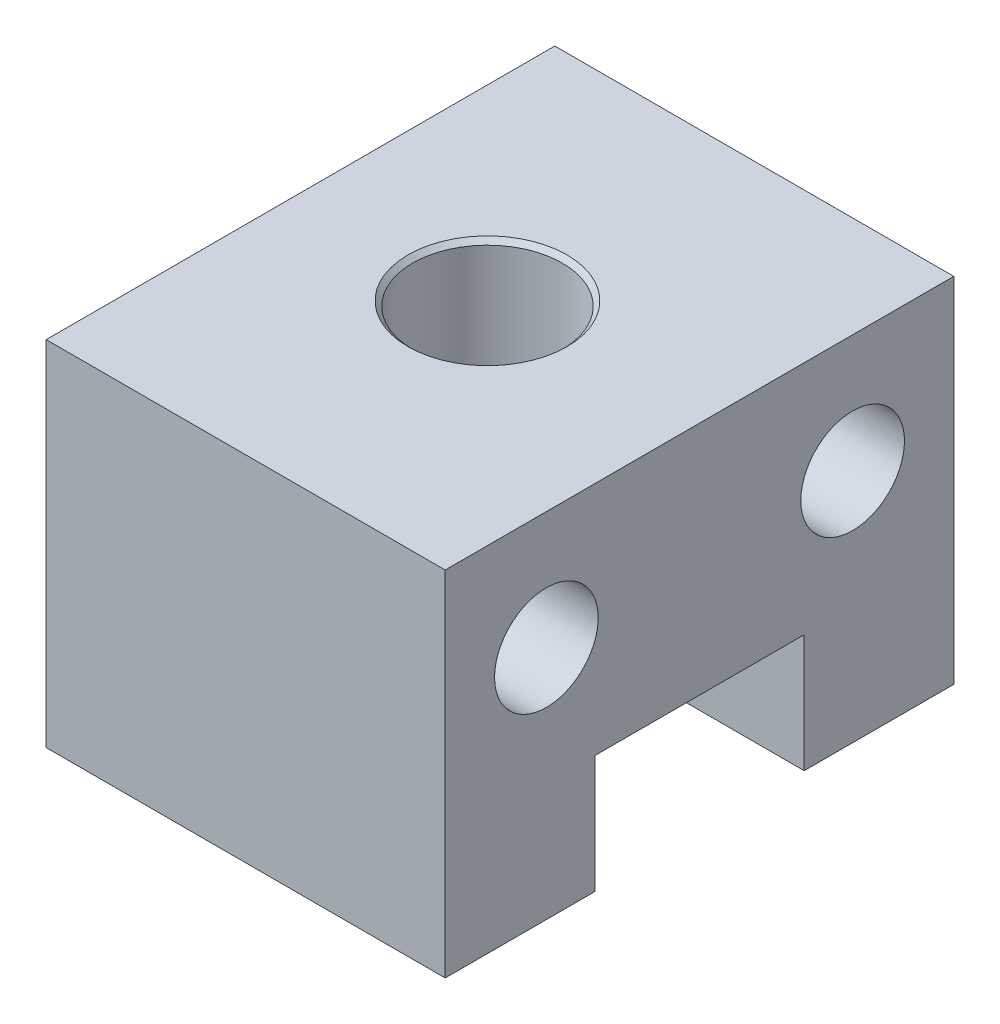
ISO-10303-21;
HEADER;
FILE_DESCRIPTION(('STEP AP214'),'2;1');
FILE_NAME('part.step','',(''),(''),'','','');
FILE_SCHEMA(('AUTOMOTIVE_DESIGN { 1 0 10303 214 1 1 1 1 }'));
ENDSEC;
DATA;
#1=APPLICATION_CONTEXT('core data for automotive mechanical design processes');
#2=APPLICATION_PROTOCOL_DEFINITION('international standard','automotive_design',2000,#1);
#3=PRODUCT_CONTEXT('',#1,'mechanical');
#4=PRODUCT('Part','Part','',(#3));
#5=PRODUCT_RELATED_PRODUCT_CATEGORY('part','',(#4));
#6=PRODUCT_DEFINITION_FORMATION('','',#4);
#7=PRODUCT_DEFINITION_CONTEXT('part definition',#1,'design');
#8=PRODUCT_DEFINITION('design','',#6,#7);
#9=PRODUCT_DEFINITION_SHAPE('','',#8);
#10=(LENGTH_UNIT() NAMED_UNIT(*) SI_UNIT(.MILLI.,.METRE.));
#11=(NAMED_UNIT(*) PLANE_ANGLE_UNIT() SI_UNIT($,.RADIAN.));
#12=(NAMED_UNIT(*) SI_UNIT($,.STERADIAN.) SOLID_ANGLE_UNIT());
#13=UNCERTAINTY_MEASURE_WITH_UNIT(LENGTH_MEASURE(1.E-05),#10,'distance_accuracy_value','');
#14=(GEOMETRIC_REPRESENTATION_CONTEXT(3) GLOBAL_UNCERTAINTY_ASSIGNED_CONTEXT((#13)) GLOBAL_UNIT_ASSIGNED_CONTEXT((#10,
#11,#12)) REPRESENTATION_CONTEXT('',''));
#15=CARTESIAN_POINT('',(0.,0.,0.));
#16=DIRECTION('',(0.,0.,1.));
#17=DIRECTION('',(1.,0.,0.));
#18=AXIS2_PLACEMENT_3D('',#15,#16,#17);
#19=CARTESIAN_POINT('',(44.45,0.,53.975));
#20=DIRECTION('',(0.,1.,0.));
#21=DIRECTION('',(0.,0.,1.));
#22=AXIS2_PLACEMENT_3D('',#19,#20,#21);
#23=PLANE('',#22);
#24=CARTESIAN_POINT('',(13.3985,0.,-34.925));
#25=DIRECTION('',(0.,-1.,0.));
#26=DIRECTION('',(0.,0.,-1.));
#27=AXIS2_PLACEMENT_3D('',#24,#25,#26);
#28=CIRCLE('',#27,2.5);
#29=CARTESIAN_POINT('',(13.3985,0.,-37.425));
#30=VERTEX_POINT('',#29);
#31=EDGE_CURVE('E178',#30,#30,#28,.T.);
#32=ORIENTED_EDGE('',*,*,#31,.F.);
#33=EDGE_LOOP('',(#32));
#34=FACE_BOUND('',#33,.T.);
#35=CARTESIAN_POINT('',(-22.9235,0.,-34.925));
#36=DIRECTION('',(0.,-1.,0.));
#37=DIRECTION('',(0.,0.,-1.));
#38=AXIS2_PLACEMENT_3D('',#35,#36,#37);
#39=CIRCLE('',#38,2.5);
#40=CARTESIAN_POINT('',(-22.9235,0.,-37.425));
#41=VERTEX_POINT('',#40);
#42=EDGE_CURVE('E167',#41,#41,#39,.T.);
#43=ORIENTED_EDGE('',*,*,#42,.F.);
#44=EDGE_LOOP('',(#43));
#45=FACE_BOUND('',#44,.T.);
#46=DIRECTION('',(-1.,0.,0.));
#47=VECTOR('',#46,1.);
#48=CARTESIAN_POINT('',(-44.45,0.,-53.975));
#49=LINE('',#48,#47);
#50=CARTESIAN_POINT('',(40.2375,0.,-53.975));
#51=VERTEX_POINT('',#50);
#52=CARTESIAN_POINT('',(-44.45,0.,-53.975));
#53=VERTEX_POINT('',#52);
#54=EDGE_CURVE('E89',#51,#53,#49,.T.);
#55=ORIENTED_EDGE('',*,*,#54,.F.);
#56=DIRECTION('',(0.,0.,1.));
#57=VECTOR('',#56,1.);
#58=CARTESIAN_POINT('',(40.2375,0.,-53.975));
#59=LINE('',#58,#57);
#60=CARTESIAN_POINT('',(40.2375,0.,-22.225));
#61=VERTEX_POINT('',#60);
#62=EDGE_CURVE('E203',#51,#61,#59,.T.);
#63=ORIENTED_EDGE('',*,*,#62,.T.);
#64=DIRECTION('',(1.,0.,0.));
#65=VECTOR('',#64,1.);
#66=CARTESIAN_POINT('',(44.45,0.,-22.225));
#67=LINE('',#66,#65);
#68=CARTESIAN_POINT('',(-44.45,0.,-22.225));
#69=VERTEX_POINT('',#68);
#70=EDGE_CURVE('E200',#69,#61,#67,.T.);
#71=ORIENTED_EDGE('',*,*,#70,.F.);
#72=DIRECTION('',(0.,0.,1.));
#73=VECTOR('',#72,1.);
#74=CARTESIAN_POINT('',(-44.45,0.,-53.975));
#75=LINE('',#74,#73);
#76=EDGE_CURVE('E88',#53,#69,#75,.T.);
#77=ORIENTED_EDGE('',*,*,#76,.F.);
#78=EDGE_LOOP('',(#55,#63,#71,#77));
#79=FACE_BOUND('',#78,.T.);
#80=ADVANCED_FACE('F38',(#34,#45,#79),#23,.F.);
#81=CARTESIAN_POINT('',(-4.7625,-128.2,0.));
#82=DIRECTION('',(0.,1.,0.));
#83=DIRECTION('',(0.,0.,1.));
#84=AXIS2_PLACEMENT_3D('',#81,#82,#83);
#85=CYLINDRICAL_SURFACE('',#84,14.2875);
#86=CARTESIAN_POINT('',(-4.7625,25.,0.));
#87=DIRECTION('',(0.,1.,0.));
#88=DIRECTION('',(0.,0.,1.));
#89=AXIS2_PLACEMENT_3D('',#86,#87,#88);
#90=CIRCLE('',#89,14.2875);
#91=CARTESIAN_POINT('',(-4.7625,25.,14.2875));
#92=VERTEX_POINT('',#91);
#93=EDGE_CURVE('E222',#92,#92,#90,.F.);
#94=ORIENTED_EDGE('',*,*,#93,.T.);
#95=EDGE_LOOP('',(#94));
#96=FACE_BOUND('',#95,.T.);
#97=CARTESIAN_POINT('',(-4.7625,36.646,0.));
#98=DIRECTION('',(0.,1.,0.));
#99=DIRECTION('',(0.,0.,1.));
#100=AXIS2_PLACEMENT_3D('',#97,#98,#99);
#101=CIRCLE('',#100,14.2875);
#102=CARTESIAN_POINT('',(-4.7625,36.646,14.2875));
#103=VERTEX_POINT('',#102);
#104=EDGE_CURVE('E109',#103,#103,#101,.F.);
#105=ORIENTED_EDGE('',*,*,#104,.F.);
#106=EDGE_LOOP('',(#105));
#107=FACE_BOUND('',#106,.T.);
#108=ADVANCED_FACE('F131',(#96,#107),#85,.F.);
#109=CARTESIAN_POINT('',(-44.45,75.,-53.975));
#110=DIRECTION('',(0.,0.,1.));
#111=DIRECTION('',(1.,0.,0.));
#112=AXIS2_PLACEMENT_3D('',#109,#110,#111);
#113=PLANE('',#112);
#114=DIRECTION('',(-1.,0.,0.));
#115=VECTOR('',#114,1.);
#116=CARTESIAN_POINT('',(-44.45,75.,-53.975));
#117=LINE('',#116,#115);
#118=CARTESIAN_POINT('',(40.2375,75.,-53.975));
#119=VERTEX_POINT('',#118);
#120=CARTESIAN_POINT('',(-44.45,75.,-53.975));
#121=VERTEX_POINT('',#120);
#122=EDGE_CURVE('E101',#119,#121,#117,.T.);
#123=ORIENTED_EDGE('',*,*,#122,.F.);
#124=DIRECTION('',(0.,1.,0.));
#125=VECTOR('',#124,1.);
#126=CARTESIAN_POINT('',(40.2375,0.,-53.975));
#127=LINE('',#126,#125);
#128=EDGE_CURVE('E192',#51,#119,#127,.T.);
#129=ORIENTED_EDGE('',*,*,#128,.F.);
#130=ORIENTED_EDGE('',*,*,#54,.T.);
#131=DIRECTION('',(0.,-1.,0.));
#132=VECTOR('',#131,1.);
#133=CARTESIAN_POINT('',(-44.45,75.,-53.975));
#134=LINE('',#133,#132);
#135=EDGE_CURVE('E98',#121,#53,#134,.T.);
#136=ORIENTED_EDGE('',*,*,#135,.F.);
#137=EDGE_LOOP('',(#123,#129,#130,#136));
#138=FACE_BOUND('',#137,.T.);
#139=ADVANCED_FACE('F137',(#138),#113,.F.);
#140=CARTESIAN_POINT('',(-44.45,75.,-53.975));
#141=DIRECTION('',(1.,0.,0.));
#142=DIRECTION('',(0.,0.,-1.));
#143=AXIS2_PLACEMENT_3D('',#140,#141,#142);
#144=PLANE('',#143);
#145=CARTESIAN_POINT('',(-44.45,50.,32.5));
#146=DIRECTION('',(-1.,0.,0.));
#147=DIRECTION('',(0.,0.,1.));
#148=AXIS2_PLACEMENT_3D('',#145,#146,#147);
#149=CIRCLE('',#148,16.5);
#150=CARTESIAN_POINT('',(-44.45,50.,49.));
#151=VERTEX_POINT('',#150);
#152=EDGE_CURVE('E469',#151,#151,#149,.T.);
#153=ORIENTED_EDGE('',*,*,#152,.F.);
#154=EDGE_LOOP('',(#153));
#155=FACE_BOUND('',#154,.T.);
#156=CARTESIAN_POINT('',(-44.45,50.,-32.5));
#157=DIRECTION('',(-1.,0.,0.));
#158=DIRECTION('',(0.,0.,1.));
#159=AXIS2_PLACEMENT_3D('',#156,#157,#158);
#160=CIRCLE('',#159,16.5);
#161=CARTESIAN_POINT('',(-44.45,50.,-16.));
#162=VERTEX_POINT('',#161);
#163=EDGE_CURVE('E478',#162,#162,#160,.T.);
#164=ORIENTED_EDGE('',*,*,#163,.F.);
#165=EDGE_LOOP('',(#164));
#166=FACE_BOUND('',#165,.T.);
#167=ORIENTED_EDGE('',*,*,#76,.T.);
#168=DIRECTION('',(0.,-1.,0.));
#169=VECTOR('',#168,1.);
#170=CARTESIAN_POINT('',(-44.45,25.,-22.225));
#171=LINE('',#170,#169);
#172=CARTESIAN_POINT('',(-44.45,25.,-22.225));
#173=VERTEX_POINT('',#172);
#174=EDGE_CURVE('E220',#173,#69,#171,.T.);
#175=ORIENTED_EDGE('',*,*,#174,.F.);
#176=DIRECTION('',(0.,0.,-1.));
#177=VECTOR('',#176,1.);
#178=CARTESIAN_POINT('',(-44.45,25.,22.225));
#179=LINE('',#178,#177);
#180=CARTESIAN_POINT('',(-44.45,25.,22.225));
#181=VERTEX_POINT('',#180);
#182=EDGE_CURVE('E213',#181,#173,#179,.T.);
#183=ORIENTED_EDGE('',*,*,#182,.F.);
#184=DIRECTION('',(0.,-1.,0.));
#185=VECTOR('',#184,1.);
#186=CARTESIAN_POINT('',(-44.45,25.,22.225));
#187=LINE('',#186,#185);
#188=CARTESIAN_POINT('',(-44.45,0.,22.225));
#189=VERTEX_POINT('',#188);
#190=EDGE_CURVE('E84',#181,#189,#187,.T.);
#191=ORIENTED_EDGE('',*,*,#190,.T.);
#192=CARTESIAN_POINT('',(-44.45,0.,53.975));
#193=VERTEX_POINT('',#192);
#194=EDGE_CURVE('E75',#189,#193,#75,.T.);
#195=ORIENTED_EDGE('',*,*,#194,.T.);
#196=DIRECTION('',(0.,-1.,0.));
#197=VECTOR('',#196,1.);
#198=CARTESIAN_POINT('',(-44.45,75.,53.975));
#199=LINE('',#198,#197);
#200=CARTESIAN_POINT('',(-44.45,75.,53.975));
#201=VERTEX_POINT('',#200);
#202=EDGE_CURVE('E79',#201,#193,#199,.T.);
#203=ORIENTED_EDGE('',*,*,#202,.F.);
#204=DIRECTION('',(0.,0.,1.));
#205=VECTOR('',#204,1.);
#206=CARTESIAN_POINT('',(-44.45,75.,-53.975));
#207=LINE('',#206,#205);
#208=EDGE_CURVE('E62',#121,#201,#207,.T.);
#209=ORIENTED_EDGE('',*,*,#208,.F.);
#210=ORIENTED_EDGE('',*,*,#135,.T.);
#211=EDGE_LOOP('',(#167,#175,#183,#191,#195,#203,#209,#210));
#212=FACE_BOUND('',#211,.T.);
#213=ADVANCED_FACE('F78',(#155,#166,#212),#144,.F.);
#214=CARTESIAN_POINT('',(-44.45,75.,53.975));
#215=DIRECTION('',(0.,0.,-1.));
#216=DIRECTION('',(-1.,0.,0.));
#217=AXIS2_PLACEMENT_3D('',#214,#215,#216);
#218=PLANE('',#217);
#219=DIRECTION('',(1.,0.,0.));
#220=VECTOR('',#219,1.);
#221=CARTESIAN_POINT('',(-44.45,0.,53.975));
#222=LINE('',#221,#220);
#223=CARTESIAN_POINT('',(40.2375,0.,53.975));
#224=VERTEX_POINT('',#223);
#225=EDGE_CURVE('E96',#193,#224,#222,.T.);
#226=ORIENTED_EDGE('',*,*,#225,.T.);
#227=DIRECTION('',(0.,1.,0.));
#228=VECTOR('',#227,1.);
#229=CARTESIAN_POINT('',(40.2375,0.,53.975));
#230=LINE('',#229,#228);
#231=CARTESIAN_POINT('',(40.2375,75.,53.975));
#232=VERTEX_POINT('',#231);
#233=EDGE_CURVE('E494',#224,#232,#230,.T.);
#234=ORIENTED_EDGE('',*,*,#233,.T.);
#235=DIRECTION('',(1.,0.,0.));
#236=VECTOR('',#235,1.);
#237=CARTESIAN_POINT('',(-44.45,75.,53.975));
#238=LINE('',#237,#236);
#239=EDGE_CURVE('E97',#201,#232,#238,.T.);
#240=ORIENTED_EDGE('',*,*,#239,.F.);
#241=ORIENTED_EDGE('',*,*,#202,.T.);
#242=EDGE_LOOP('',(#226,#234,#240,#241));
#243=FACE_BOUND('',#242,.T.);
#244=ADVANCED_FACE('F93',(#243),#218,.F.);
#245=CARTESIAN_POINT('',(44.45,75.,53.975));
#246=DIRECTION('',(0.,1.,0.));
#247=DIRECTION('',(0.,0.,1.));
#248=AXIS2_PLACEMENT_3D('',#245,#246,#247);
#249=PLANE('',#248);
#250=CARTESIAN_POINT('',(-4.7625,75.,0.));
#251=DIRECTION('',(0.,1.,0.));
#252=DIRECTION('',(0.,0.,1.));
#253=AXIS2_PLACEMENT_3D('',#250,#251,#252);
#254=CIRCLE('',#253,16.8750000000001);
#255=CARTESIAN_POINT('',(-4.7625,75.,16.8750000000001));
#256=VERTEX_POINT('',#255);
#257=EDGE_CURVE('E11',#256,#256,#254,.F.);
#258=ORIENTED_EDGE('',*,*,#257,.T.);
#259=EDGE_LOOP('',(#258));
#260=FACE_BOUND('',#259,.T.);
#261=DIRECTION('',(0.,0.,1.));
#262=VECTOR('',#261,1.);
#263=CARTESIAN_POINT('',(40.2375,75.,-53.975));
#264=LINE('',#263,#262);
#265=EDGE_CURVE('E490',#119,#232,#264,.T.);
#266=ORIENTED_EDGE('',*,*,#265,.F.);
#267=ORIENTED_EDGE('',*,*,#122,.T.);
#268=ORIENTED_EDGE('',*,*,#208,.T.);
#269=ORIENTED_EDGE('',*,*,#239,.T.);
#270=EDGE_LOOP('',(#266,#267,#268,#269));
#271=FACE_BOUND('',#270,.T.);
#272=ADVANCED_FACE('F146',(#260,#271),#249,.T.);
#273=CARTESIAN_POINT('',(-22.9235,0.,34.925));
#274=DIRECTION('',(0.,-1.,0.));
#275=DIRECTION('',(0.,0.,-1.));
#276=AXIS2_PLACEMENT_3D('',#273,#274,#275);
#277=CIRCLE('',#276,2.5);
#278=CARTESIAN_POINT('',(-22.9235,0.,32.425));
#279=VERTEX_POINT('',#278);
#280=EDGE_CURVE('E112',#279,#279,#277,.T.);
#281=ORIENTED_EDGE('',*,*,#280,.F.);
#282=EDGE_LOOP('',(#281));
#283=FACE_BOUND('',#282,.T.);
#284=CARTESIAN_POINT('',(13.3985,0.,34.925));
#285=DIRECTION('',(0.,-1.,0.));
#286=DIRECTION('',(0.,0.,-1.));
#287=AXIS2_PLACEMENT_3D('',#284,#285,#286);
#288=CIRCLE('',#287,2.5);
#289=CARTESIAN_POINT('',(13.3985,0.,32.425));
#290=VERTEX_POINT('',#289);
#291=EDGE_CURVE('E161',#290,#290,#288,.T.);
#292=ORIENTED_EDGE('',*,*,#291,.F.);
#293=EDGE_LOOP('',(#292));
#294=FACE_BOUND('',#293,.T.);
#295=DIRECTION('',(-1.,0.,0.));
#296=VECTOR('',#295,1.);
#297=CARTESIAN_POINT('',(44.45,0.,22.225));
#298=LINE('',#297,#296);
#299=CARTESIAN_POINT('',(40.2375,0.,22.225));
#300=VERTEX_POINT('',#299);
#301=EDGE_CURVE('E210',#300,#189,#298,.T.);
#302=ORIENTED_EDGE('',*,*,#301,.F.);
#303=EDGE_CURVE('E53',#300,#224,#59,.T.);
#304=ORIENTED_EDGE('',*,*,#303,.T.);
#305=ORIENTED_EDGE('',*,*,#225,.F.);
#306=ORIENTED_EDGE('',*,*,#194,.F.);
#307=EDGE_LOOP('',(#302,#304,#305,#306));
#308=FACE_BOUND('',#307,.T.);
#309=ADVANCED_FACE('F100',(#283,#294,#308),#23,.F.);
#310=CARTESIAN_POINT('',(13.3985,27.9908,-34.925));
#311=DIRECTION('',(0.,-1.,0.));
#312=DIRECTION('',(0.,0.,-1.));
#313=AXIS2_PLACEMENT_3D('',#310,#311,#312);
#314=CONICAL_SURFACE('',#313,2.49999999999999,1.02974425867665);
#315=CARTESIAN_POINT('',(13.3985,29.4929515475689,-34.925));
#316=VERTEX_POINT('',#315);
#317=VERTEX_LOOP('',#316);
#318=FACE_BOUND('',#317,.T.);
#319=CARTESIAN_POINT('',(13.3985,27.9908,-34.925));
#320=DIRECTION('',(0.,-1.,0.));
#321=DIRECTION('',(0.,0.,-1.));
#322=AXIS2_PLACEMENT_3D('',#319,#320,#321);
#323=CIRCLE('',#322,2.49999999999999);
#324=CARTESIAN_POINT('',(13.3985,27.9908,-37.425));
#325=VERTEX_POINT('',#324);
#326=EDGE_CURVE('E181',#325,#325,#323,.T.);
#327=ORIENTED_EDGE('',*,*,#326,.T.);
#328=EDGE_LOOP('',(#327));
#329=FACE_BOUND('',#328,.T.);
#330=ADVANCED_FACE('F145',(#318,#329),#314,.F.);
#331=CARTESIAN_POINT('',(13.3985,0.,-34.925));
#332=DIRECTION('',(0.,-1.,0.));
#333=DIRECTION('',(0.,0.,-1.));
#334=AXIS2_PLACEMENT_3D('',#331,#332,#333);
#335=CYLINDRICAL_SURFACE('',#334,2.5);
#336=ORIENTED_EDGE('',*,*,#326,.F.);
#337=EDGE_LOOP('',(#336));
#338=FACE_BOUND('',#337,.T.);
#339=ORIENTED_EDGE('',*,*,#31,.T.);
#340=EDGE_LOOP('',(#339));
#341=FACE_BOUND('',#340,.T.);
#342=ADVANCED_FACE('F152',(#338,#341),#335,.F.);
#343=CARTESIAN_POINT('',(-22.9235,27.9908,-34.925));
#344=DIRECTION('',(0.,-1.,0.));
#345=DIRECTION('',(0.,0.,-1.));
#346=AXIS2_PLACEMENT_3D('',#343,#344,#345);
#347=CONICAL_SURFACE('',#346,2.5,1.02974425867665);
#348=CARTESIAN_POINT('',(-22.9235,29.4929515475689,-34.925));
#349=VERTEX_POINT('',#348);
#350=VERTEX_LOOP('',#349);
#351=FACE_BOUND('',#350,.T.);
#352=CARTESIAN_POINT('',(-22.9235,27.9908,-34.925));
#353=DIRECTION('',(0.,-1.,0.));
#354=DIRECTION('',(0.,0.,-1.));
#355=AXIS2_PLACEMENT_3D('',#352,#353,#354);
#356=CIRCLE('',#355,2.5);
#357=CARTESIAN_POINT('',(-22.9235,27.9908,-37.425));
#358=VERTEX_POINT('',#357);
#359=EDGE_CURVE('E175',#358,#358,#356,.T.);
#360=ORIENTED_EDGE('',*,*,#359,.T.);
#361=EDGE_LOOP('',(#360));
#362=FACE_BOUND('',#361,.T.);
#363=ADVANCED_FACE('F257',(#351,#362),#347,.F.);
#364=CARTESIAN_POINT('',(-22.9235,0.,-34.925));
#365=DIRECTION('',(0.,-1.,0.));
#366=DIRECTION('',(0.,0.,-1.));
#367=AXIS2_PLACEMENT_3D('',#364,#365,#366);
#368=CYLINDRICAL_SURFACE('',#367,2.5);
#369=ORIENTED_EDGE('',*,*,#359,.F.);
#370=EDGE_LOOP('',(#369));
#371=FACE_BOUND('',#370,.T.);
#372=ORIENTED_EDGE('',*,*,#42,.T.);
#373=EDGE_LOOP('',(#372));
#374=FACE_BOUND('',#373,.T.);
#375=ADVANCED_FACE('F253',(#371,#374),#368,.F.);
#376=CARTESIAN_POINT('',(13.3985,27.9908,34.925));
#377=DIRECTION('',(0.,-1.,0.));
#378=DIRECTION('',(0.,0.,-1.));
#379=AXIS2_PLACEMENT_3D('',#376,#377,#378);
#380=CONICAL_SURFACE('',#379,2.49999999999999,1.02974425867665);
#381=CARTESIAN_POINT('',(13.3985,29.4929515475689,34.925));
#382=VERTEX_POINT('',#381);
#383=VERTEX_LOOP('',#382);
#384=FACE_BOUND('',#383,.T.);
#385=CARTESIAN_POINT('',(13.3985,27.9908,34.925));
#386=DIRECTION('',(0.,-1.,0.));
#387=DIRECTION('',(0.,0.,-1.));
#388=AXIS2_PLACEMENT_3D('',#385,#386,#387);
#389=CIRCLE('',#388,2.49999999999999);
#390=CARTESIAN_POINT('',(13.3985,27.9908,32.425));
#391=VERTEX_POINT('',#390);
#392=EDGE_CURVE('E163',#391,#391,#389,.T.);
#393=ORIENTED_EDGE('',*,*,#392,.T.);
#394=EDGE_LOOP('',(#393));
#395=FACE_BOUND('',#394,.T.);
#396=ADVANCED_FACE('F249',(#384,#395),#380,.F.);
#397=CARTESIAN_POINT('',(13.3985,0.,34.925));
#398=DIRECTION('',(0.,-1.,0.));
#399=DIRECTION('',(0.,0.,-1.));
#400=AXIS2_PLACEMENT_3D('',#397,#398,#399);
#401=CYLINDRICAL_SURFACE('',#400,2.5);
#402=ORIENTED_EDGE('',*,*,#392,.F.);
#403=EDGE_LOOP('',(#402));
#404=FACE_BOUND('',#403,.T.);
#405=ORIENTED_EDGE('',*,*,#291,.T.);
#406=EDGE_LOOP('',(#405));
#407=FACE_BOUND('',#406,.T.);
#408=ADVANCED_FACE('F241',(#404,#407),#401,.F.);
#409=CARTESIAN_POINT('',(-22.9235,27.9908,34.925));
#410=DIRECTION('',(0.,-1.,0.));
#411=DIRECTION('',(0.,0.,-1.));
#412=AXIS2_PLACEMENT_3D('',#409,#410,#411);
#413=CONICAL_SURFACE('',#412,2.5,1.02974425867665);
#414=CARTESIAN_POINT('',(-22.9235,29.4929515475689,34.925));
#415=VERTEX_POINT('',#414);
#416=VERTEX_LOOP('',#415);
#417=FACE_BOUND('',#416,.T.);
#418=CARTESIAN_POINT('',(-22.9235,27.9908,34.925));
#419=DIRECTION('',(0.,-1.,0.));
#420=DIRECTION('',(0.,0.,-1.));
#421=AXIS2_PLACEMENT_3D('',#418,#419,#420);
#422=CIRCLE('',#421,2.5);
#423=CARTESIAN_POINT('',(-22.9235,27.9908,32.425));
#424=VERTEX_POINT('',#423);
#425=EDGE_CURVE('E164',#424,#424,#422,.T.);
#426=ORIENTED_EDGE('',*,*,#425,.T.);
#427=EDGE_LOOP('',(#426));
#428=FACE_BOUND('',#427,.T.);
#429=ADVANCED_FACE('F232',(#417,#428),#413,.F.);
#430=CARTESIAN_POINT('',(-22.9235,0.,34.925));
#431=DIRECTION('',(0.,-1.,0.));
#432=DIRECTION('',(0.,0.,-1.));
#433=AXIS2_PLACEMENT_3D('',#430,#431,#432);
#434=CYLINDRICAL_SURFACE('',#433,2.5);
#435=ORIENTED_EDGE('',*,*,#425,.F.);
#436=EDGE_LOOP('',(#435));
#437=FACE_BOUND('',#436,.T.);
#438=ORIENTED_EDGE('',*,*,#280,.T.);
#439=EDGE_LOOP('',(#438));
#440=FACE_BOUND('',#439,.T.);
#441=ADVANCED_FACE('F229',(#437,#440),#434,.F.);
#442=CARTESIAN_POINT('',(-4.7625,36.646,0.));
#443=DIRECTION('',(0.,1.,0.));
#444=DIRECTION('',(0.,0.,1.));
#445=AXIS2_PLACEMENT_3D('',#442,#443,#444);
#446=PLANE('',#445);
#447=CARTESIAN_POINT('',(-4.7625,36.646,0.));
#448=DIRECTION('',(0.,1.,0.));
#449=DIRECTION('',(0.,0.,1.));
#450=AXIS2_PLACEMENT_3D('',#447,#448,#449);
#451=CIRCLE('',#450,15.875);
#452=CARTESIAN_POINT('',(-4.7625,36.646,15.875));
#453=VERTEX_POINT('',#452);
#454=EDGE_CURVE('E113',#453,#453,#451,.T.);
#455=ORIENTED_EDGE('',*,*,#454,.T.);
#456=EDGE_LOOP('',(#455));
#457=FACE_BOUND('',#456,.T.);
#458=ORIENTED_EDGE('',*,*,#104,.T.);
#459=EDGE_LOOP('',(#458));
#460=FACE_BOUND('',#459,.T.);
#461=ADVANCED_FACE('F231',(#457,#460),#446,.T.);
#462=CARTESIAN_POINT('',(-4.7625,36.646,0.));
#463=DIRECTION('',(0.,1.,0.));
#464=DIRECTION('',(0.,0.,1.));
#465=AXIS2_PLACEMENT_3D('',#462,#463,#464);
#466=CYLINDRICAL_SURFACE('',#465,15.875);
#467=CARTESIAN_POINT('',(-4.7625,73.9999999999998,0.));
#468=DIRECTION('',(0.,1.,0.));
#469=DIRECTION('',(0.,0.,1.));
#470=AXIS2_PLACEMENT_3D('',#467,#468,#469);
#471=CIRCLE('',#470,15.875);
#472=CARTESIAN_POINT('',(-4.7625,73.9999999999998,15.875));
#473=VERTEX_POINT('',#472);
#474=EDGE_CURVE('E46',#473,#473,#471,.T.);
#475=CARTESIAN_POINT('',(-4.7625,73.9999999999998,15.875));
#476=CARTESIAN_POINT('',(-4.7625,73.6108958333332,15.875));
#477=CARTESIAN_POINT('',(-4.7625,73.2217916666665,15.875));
#478=CARTESIAN_POINT('',(-4.7625,72.4435833333332,15.875));
#479=CARTESIAN_POINT('',(-4.7625,72.0544791666665,15.875));
#480=CARTESIAN_POINT('',(-4.7625,71.2762708333332,15.875));
#481=CARTESIAN_POINT('',(-4.7625,70.8871666666665,15.875));
#482=CARTESIAN_POINT('',(-4.7625,70.1089583333332,15.875));
#483=CARTESIAN_POINT('',(-4.7625,69.7198541666665,15.875));
#484=CARTESIAN_POINT('',(-4.7625,68.9416458333332,15.875));
#485=CARTESIAN_POINT('',(-4.7625,68.5525416666665,15.875));
#486=CARTESIAN_POINT('',(-4.7625,67.7743333333332,15.875));
#487=CARTESIAN_POINT('',(-4.7625,67.3852291666665,15.875));
#488=CARTESIAN_POINT('',(-4.7625,66.6070208333332,15.875));
#489=CARTESIAN_POINT('',(-4.7625,66.2179166666665,15.875));
#490=CARTESIAN_POINT('',(-4.7625,65.4397083333332,15.875));
#491=CARTESIAN_POINT('',(-4.7625,65.0506041666665,15.875));
#492=CARTESIAN_POINT('',(-4.7625,64.2723958333332,15.875));
#493=CARTESIAN_POINT('',(-4.7625,63.8832916666666,15.875));
#494=CARTESIAN_POINT('',(-4.7625,63.1050833333332,15.875));
#495=CARTESIAN_POINT('',(-4.7625,62.7159791666666,15.875));
#496=CARTESIAN_POINT('',(-4.7625,61.9377708333332,15.875));
#497=CARTESIAN_POINT('',(-4.7625,61.5486666666666,15.875));
#498=CARTESIAN_POINT('',(-4.7625,60.7704583333332,15.875));
#499=CARTESIAN_POINT('',(-4.7625,60.3813541666666,15.875));
#500=CARTESIAN_POINT('',(-4.7625,59.6031458333332,15.875));
#501=CARTESIAN_POINT('',(-4.7625,59.2140416666666,15.875));
#502=CARTESIAN_POINT('',(-4.7625,58.4358333333332,15.875));
#503=CARTESIAN_POINT('',(-4.7625,58.0467291666666,15.875));
#504=CARTESIAN_POINT('',(-4.7625,57.2685208333332,15.875));
#505=CARTESIAN_POINT('',(-4.7625,56.8794166666666,15.875));
#506=CARTESIAN_POINT('',(-4.7625,56.1012083333332,15.875));
#507=CARTESIAN_POINT('',(-4.7625,55.7121041666666,15.875));
#508=CARTESIAN_POINT('',(-4.7625,54.9338958333333,15.875));
#509=CARTESIAN_POINT('',(-4.7625,54.5447916666666,15.875));
#510=CARTESIAN_POINT('',(-4.7625,53.7665833333333,15.875));
#511=CARTESIAN_POINT('',(-4.7625,53.3774791666666,15.875));
#512=CARTESIAN_POINT('',(-4.7625,52.5992708333333,15.875));
#513=CARTESIAN_POINT('',(-4.7625,52.2101666666666,15.875));
#514=CARTESIAN_POINT('',(-4.7625,51.4319583333333,15.875));
#515=CARTESIAN_POINT('',(-4.7625,51.0428541666666,15.875));
#516=CARTESIAN_POINT('',(-4.7625,50.2646458333333,15.875));
#517=CARTESIAN_POINT('',(-4.7625,49.8755416666666,15.875));
#518=CARTESIAN_POINT('',(-4.7625,49.0973333333333,15.875));
#519=CARTESIAN_POINT('',(-4.7625,48.7082291666666,15.875));
#520=CARTESIAN_POINT('',(-4.7625,47.9300208333333,15.875));
#521=CARTESIAN_POINT('',(-4.7625,47.5409166666666,15.875));
#522=CARTESIAN_POINT('',(-4.7625,46.7627083333333,15.875));
#523=CARTESIAN_POINT('',(-4.7625,46.3736041666666,15.875));
#524=CARTESIAN_POINT('',(-4.7625,45.5953958333333,15.875));
#525=CARTESIAN_POINT('',(-4.7625,45.2062916666666,15.875));
#526=CARTESIAN_POINT('',(-4.7625,44.4280833333333,15.875));
#527=CARTESIAN_POINT('',(-4.7625,44.0389791666666,15.875));
#528=CARTESIAN_POINT('',(-4.7625,43.2607708333333,15.875));
#529=CARTESIAN_POINT('',(-4.7625,42.8716666666666,15.875));
#530=CARTESIAN_POINT('',(-4.7625,42.0934583333333,15.875));
#531=CARTESIAN_POINT('',(-4.7625,41.7043541666666,15.875));
#532=CARTESIAN_POINT('',(-4.7625,40.9261458333333,15.875));
#533=CARTESIAN_POINT('',(-4.7625,40.5370416666666,15.875));
#534=CARTESIAN_POINT('',(-4.7625,39.7588333333333,15.875));
#535=CARTESIAN_POINT('',(-4.7625,39.3697291666667,15.875));
#536=CARTESIAN_POINT('',(-4.7625,38.5915208333333,15.875));
#537=CARTESIAN_POINT('',(-4.7625,38.2024166666667,15.875));
#538=CARTESIAN_POINT('',(-4.7625,37.4242083333333,15.875));
#539=CARTESIAN_POINT('',(-4.7625,37.0351041666667,15.875));
#540=CARTESIAN_POINT('',(-4.7625,36.646,15.875));
#541=B_SPLINE_CURVE_WITH_KNOTS('',3,(#475,#476,#477,#478,#479,#480,#481,#482,#483,#484,#485,
#486,#487,#488,#489,#490,#491,#492,#493,#494,#495,#496,#497,#498,#499,#500,#501,#502,#503,#504,
#505,#506,#507,#508,#509,#510,#511,#512,#513,#514,#515,#516,#517,#518,#519,#520,#521,#522,#523,
#524,#525,#526,#527,#528,#529,#530,#531,#532,#533,#534,#535,#536,#537,#538,#539,#540),
.UNSPECIFIED.,.F.,.F.,(4,2,2,2,2,2,2,2,2,2,2,2,2,2,2,2,2,2,2,2,2,2,2,2,2,2,2,2,2,2,2,2,4),(0.,
1.1673125,2.33462500000001,3.5019375,4.66924999999999,5.83656249999998,7.00387499999998,
8.17118749999997,9.33849999999997,10.5058125,11.673125,12.8404375,14.0077499999999,
15.1750624999999,16.3423749999999,17.5096874999999,18.6769999999999,19.8443124999999,
21.0116249999999,22.1789374999999,23.3462499999999,24.5135624999999,25.6808749999999,
26.8481874999999,28.0154999999999,29.1828124999999,30.3501249999999,31.5174374999999,
32.6847499999999,33.8520624999999,35.0193749999999,36.1866874999998,37.3539999999998),.UNSPECIFIED.);
#542=EDGE_CURVE('BSEAM117',#473,#453,#541,.T.);
#543=ORIENTED_EDGE('',*,*,#474,.T.);
#544=ORIENTED_EDGE('',*,*,#454,.F.);
#545=ORIENTED_EDGE('',*,*,#542,.T.);
#546=ORIENTED_EDGE('',*,*,#542,.F.);
#547=EDGE_LOOP('',(#543,#545,#544,#546));
#548=FACE_BOUND('',#547,.T.);
#549=ADVANCED_FACE('F117',(#548),#466,.F.);
#550=CARTESIAN_POINT('',(44.45,25.,-22.225));
#551=DIRECTION('',(0.,1.,0.));
#552=DIRECTION('',(0.,0.,1.));
#553=AXIS2_PLACEMENT_3D('',#550,#551,#552);
#554=PLANE('',#553);
#555=DIRECTION('',(1.,0.,0.));
#556=VECTOR('',#555,1.);
#557=CARTESIAN_POINT('',(44.45,25.,-22.225));
#558=LINE('',#557,#556);
#559=CARTESIAN_POINT('',(40.2375,25.,-22.225));
#560=VERTEX_POINT('',#559);
#561=EDGE_CURVE('E224',#173,#560,#558,.T.);
#562=ORIENTED_EDGE('',*,*,#561,.T.);
#563=DIRECTION('',(0.,0.,1.));
#564=VECTOR('',#563,1.);
#565=CARTESIAN_POINT('',(40.2375,25.,-22.225));
#566=LINE('',#565,#564);
#567=CARTESIAN_POINT('',(40.2375,25.,22.225));
#568=VERTEX_POINT('',#567);
#569=EDGE_CURVE('E496',#560,#568,#566,.T.);
#570=ORIENTED_EDGE('',*,*,#569,.T.);
#571=DIRECTION('',(-1.,0.,0.));
#572=VECTOR('',#571,1.);
#573=CARTESIAN_POINT('',(44.45,25.,22.225));
#574=LINE('',#573,#572);
#575=EDGE_CURVE('E209',#568,#181,#574,.T.);
#576=ORIENTED_EDGE('',*,*,#575,.T.);
#577=ORIENTED_EDGE('',*,*,#182,.T.);
#578=EDGE_LOOP('',(#562,#570,#576,#577));
#579=FACE_BOUND('',#578,.T.);
#580=ORIENTED_EDGE('',*,*,#93,.F.);
#581=EDGE_LOOP('',(#580));
#582=FACE_BOUND('',#581,.T.);
#583=ADVANCED_FACE('F349',(#579,#582),#554,.F.);
#584=CARTESIAN_POINT('',(44.45,25.,-22.225));
#585=DIRECTION('',(0.,0.,-1.));
#586=DIRECTION('',(-1.,0.,0.));
#587=AXIS2_PLACEMENT_3D('',#584,#585,#586);
#588=PLANE('',#587);
#589=ORIENTED_EDGE('',*,*,#70,.T.);
#590=DIRECTION('',(0.,1.,0.));
#591=VECTOR('',#590,1.);
#592=CARTESIAN_POINT('',(40.2375,25.,-22.225));
#593=LINE('',#592,#591);
#594=EDGE_CURVE('E216',#61,#560,#593,.T.);
#595=ORIENTED_EDGE('',*,*,#594,.T.);
#596=ORIENTED_EDGE('',*,*,#561,.F.);
#597=ORIENTED_EDGE('',*,*,#174,.T.);
#598=EDGE_LOOP('',(#589,#595,#596,#597));
#599=FACE_BOUND('',#598,.T.);
#600=ADVANCED_FACE('F353',(#599),#588,.F.);
#601=CARTESIAN_POINT('',(44.45,25.,22.225));
#602=DIRECTION('',(0.,0.,1.));
#603=DIRECTION('',(1.,0.,0.));
#604=AXIS2_PLACEMENT_3D('',#601,#602,#603);
#605=PLANE('',#604);
#606=ORIENTED_EDGE('',*,*,#575,.F.);
#607=DIRECTION('',(0.,-1.,0.));
#608=VECTOR('',#607,1.);
#609=CARTESIAN_POINT('',(40.2375,25.,22.225));
#610=LINE('',#609,#608);
#611=EDGE_CURVE('E108',#568,#300,#610,.T.);
#612=ORIENTED_EDGE('',*,*,#611,.T.);
#613=ORIENTED_EDGE('',*,*,#301,.T.);
#614=ORIENTED_EDGE('',*,*,#190,.F.);
#615=EDGE_LOOP('',(#606,#612,#613,#614));
#616=FACE_BOUND('',#615,.T.);
#617=ADVANCED_FACE('F363',(#616),#605,.F.);
#618=CARTESIAN_POINT('',(40.2375,0.,-53.975));
#619=DIRECTION('',(-1.,0.,0.));
#620=DIRECTION('',(0.,0.,1.));
#621=AXIS2_PLACEMENT_3D('',#618,#619,#620);
#622=PLANE('',#621);
#623=CARTESIAN_POINT('',(40.2375,50.,32.5));
#624=DIRECTION('',(-1.,0.,0.));
#625=DIRECTION('',(0.,0.,1.));
#626=AXIS2_PLACEMENT_3D('',#623,#624,#625);
#627=CIRCLE('',#626,11.);
#628=CARTESIAN_POINT('',(40.2375,50.,43.5));
#629=VERTEX_POINT('',#628);
#630=EDGE_CURVE('E471',#629,#629,#627,.T.);
#631=ORIENTED_EDGE('',*,*,#630,.T.);
#632=EDGE_LOOP('',(#631));
#633=FACE_BOUND('',#632,.T.);
#634=CARTESIAN_POINT('',(40.2375,50.,-32.5));
#635=DIRECTION('',(-1.,0.,0.));
#636=DIRECTION('',(0.,0.,1.));
#637=AXIS2_PLACEMENT_3D('',#634,#635,#636);
#638=CIRCLE('',#637,11.);
#639=CARTESIAN_POINT('',(40.2375,50.,-21.5));
#640=VERTEX_POINT('',#639);
#641=EDGE_CURVE('E487',#640,#640,#638,.T.);
#642=ORIENTED_EDGE('',*,*,#641,.T.);
#643=EDGE_LOOP('',(#642));
#644=FACE_BOUND('',#643,.T.);
#645=ORIENTED_EDGE('',*,*,#62,.F.);
#646=ORIENTED_EDGE('',*,*,#128,.T.);
#647=ORIENTED_EDGE('',*,*,#265,.T.);
#648=ORIENTED_EDGE('',*,*,#233,.F.);
#649=ORIENTED_EDGE('',*,*,#303,.F.);
#650=ORIENTED_EDGE('',*,*,#611,.F.);
#651=ORIENTED_EDGE('',*,*,#569,.F.);
#652=ORIENTED_EDGE('',*,*,#594,.F.);
#653=EDGE_LOOP('',(#645,#646,#647,#648,#649,#650,#651,#652));
#654=FACE_BOUND('',#653,.T.);
#655=ADVANCED_FACE('F372',(#633,#644,#654),#622,.F.);
#656=CARTESIAN_POINT('',(-44.45,50.,-32.5));
#657=DIRECTION('',(-1.,0.,0.));
#658=DIRECTION('',(0.,0.,1.));
#659=AXIS2_PLACEMENT_3D('',#656,#657,#658);
#660=CYLINDRICAL_SURFACE('',#659,11.);
#661=ORIENTED_EDGE('',*,*,#641,.F.);
#662=EDGE_LOOP('',(#661));
#663=FACE_BOUND('',#662,.T.);
#664=CARTESIAN_POINT('',(-24.45,50.,-32.5));
#665=DIRECTION('',(-1.,0.,0.));
#666=DIRECTION('',(0.,0.,1.));
#667=AXIS2_PLACEMENT_3D('',#664,#665,#666);
#668=CIRCLE('',#667,11.);
#669=CARTESIAN_POINT('',(-24.45,50.,-21.5));
#670=VERTEX_POINT('',#669);
#671=EDGE_CURVE('E484',#670,#670,#668,.T.);
#672=ORIENTED_EDGE('',*,*,#671,.T.);
#673=EDGE_LOOP('',(#672));
#674=FACE_BOUND('',#673,.T.);
#675=ADVANCED_FACE('F389',(#663,#674),#660,.F.);
#676=CARTESIAN_POINT('',(-24.45,61.,-32.5));
#677=DIRECTION('',(1.,0.,0.));
#678=DIRECTION('',(0.,0.,-1.));
#679=AXIS2_PLACEMENT_3D('',#676,#677,#678);
#680=PLANE('',#679);
#681=ORIENTED_EDGE('',*,*,#671,.F.);
#682=EDGE_LOOP('',(#681));
#683=FACE_BOUND('',#682,.T.);
#684=CARTESIAN_POINT('',(-24.45,50.,-32.5));
#685=DIRECTION('',(-1.,0.,0.));
#686=DIRECTION('',(0.,0.,1.));
#687=AXIS2_PLACEMENT_3D('',#684,#685,#686);
#688=CIRCLE('',#687,16.5);
#689=CARTESIAN_POINT('',(-24.45,50.,-16.));
#690=VERTEX_POINT('',#689);
#691=EDGE_CURVE('E481',#690,#690,#688,.T.);
#692=ORIENTED_EDGE('',*,*,#691,.T.);
#693=EDGE_LOOP('',(#692));
#694=FACE_BOUND('',#693,.T.);
#695=ADVANCED_FACE('F399',(#683,#694),#680,.F.);
#696=CARTESIAN_POINT('',(-44.45,50.,-32.5));
#697=DIRECTION('',(-1.,0.,0.));
#698=DIRECTION('',(0.,0.,1.));
#699=AXIS2_PLACEMENT_3D('',#696,#697,#698);
#700=CYLINDRICAL_SURFACE('',#699,16.5);
#701=ORIENTED_EDGE('',*,*,#691,.F.);
#702=EDGE_LOOP('',(#701));
#703=FACE_BOUND('',#702,.T.);
#704=ORIENTED_EDGE('',*,*,#163,.T.);
#705=EDGE_LOOP('',(#704));
#706=FACE_BOUND('',#705,.T.);
#707=ADVANCED_FACE('F409',(#703,#706),#700,.F.);
#708=CARTESIAN_POINT('',(-44.45,50.,32.5));
#709=DIRECTION('',(-1.,0.,0.));
#710=DIRECTION('',(0.,0.,1.));
#711=AXIS2_PLACEMENT_3D('',#708,#709,#710);
#712=CYLINDRICAL_SURFACE('',#711,11.);
#713=ORIENTED_EDGE('',*,*,#630,.F.);
#714=EDGE_LOOP('',(#713));
#715=FACE_BOUND('',#714,.T.);
#716=CARTESIAN_POINT('',(-24.45,50.,32.5));
#717=DIRECTION('',(-1.,0.,0.));
#718=DIRECTION('',(0.,0.,1.));
#719=AXIS2_PLACEMENT_3D('',#716,#717,#718);
#720=CIRCLE('',#719,11.);
#721=CARTESIAN_POINT('',(-24.45,50.,43.5));
#722=VERTEX_POINT('',#721);
#723=EDGE_CURVE('E465',#722,#722,#720,.T.);
#724=ORIENTED_EDGE('',*,*,#723,.T.);
#725=EDGE_LOOP('',(#724));
#726=FACE_BOUND('',#725,.T.);
#727=ADVANCED_FACE('F419',(#715,#726),#712,.F.);
#728=CARTESIAN_POINT('',(-24.45,61.,32.5));
#729=DIRECTION('',(1.,0.,0.));
#730=DIRECTION('',(0.,0.,-1.));
#731=AXIS2_PLACEMENT_3D('',#728,#729,#730);
#732=PLANE('',#731);
#733=ORIENTED_EDGE('',*,*,#723,.F.);
#734=EDGE_LOOP('',(#733));
#735=FACE_BOUND('',#734,.T.);
#736=CARTESIAN_POINT('',(-24.45,50.,32.5));
#737=DIRECTION('',(-1.,0.,0.));
#738=DIRECTION('',(0.,0.,1.));
#739=AXIS2_PLACEMENT_3D('',#736,#737,#738);
#740=CIRCLE('',#739,16.5);
#741=CARTESIAN_POINT('',(-24.45,50.,49.));
#742=VERTEX_POINT('',#741);
#743=EDGE_CURVE('E468',#742,#742,#740,.T.);
#744=ORIENTED_EDGE('',*,*,#743,.T.);
#745=EDGE_LOOP('',(#744));
#746=FACE_BOUND('',#745,.T.);
#747=ADVANCED_FACE('F126',(#735,#746),#732,.F.);
#748=CARTESIAN_POINT('',(-44.45,50.,32.5));
#749=DIRECTION('',(-1.,0.,0.));
#750=DIRECTION('',(0.,0.,1.));
#751=AXIS2_PLACEMENT_3D('',#748,#749,#750);
#752=CYLINDRICAL_SURFACE('',#751,16.5);
#753=ORIENTED_EDGE('',*,*,#743,.F.);
#754=EDGE_LOOP('',(#753));
#755=FACE_BOUND('',#754,.T.);
#756=ORIENTED_EDGE('',*,*,#152,.T.);
#757=EDGE_LOOP('',(#756));
#758=FACE_BOUND('',#757,.T.);
#759=ADVANCED_FACE('F121',(#755,#758),#752,.F.);
#760=CARTESIAN_POINT('',(-4.7625,73.9999999999998,0.));
#761=DIRECTION('',(0.,1.,0.));
#762=DIRECTION('',(0.,0.,1.));
#763=AXIS2_PLACEMENT_3D('',#760,#761,#762);
#764=CONICAL_SURFACE('',#763,15.875,0.785398163397445);
#765=ORIENTED_EDGE('',*,*,#257,.F.);
#766=EDGE_LOOP('',(#765));
#767=FACE_BOUND('',#766,.T.);
#768=ORIENTED_EDGE('',*,*,#474,.F.);
#769=EDGE_LOOP('',(#768));
#770=FACE_BOUND('',#769,.T.);
#771=ADVANCED_FACE('F40',(#767,#770),#764,.F.);
#772=CLOSED_SHELL('',(#80,#108,#139,#213,#244,#272,#309,#330,#342,#363,#375,#396,#408,#429,#441,
#461,#549,#583,#600,#617,#655,#675,#695,#707,#727,#747,#759,#771));
#773=MANIFOLD_SOLID_BREP('B2',#772);
#774=ADVANCED_BREP_SHAPE_REPRESENTATION('',(#18,#773),#14);
#775=SHAPE_DEFINITION_REPRESENTATION(#9,#774);
ENDSEC;
END-ISO-10303-21;
